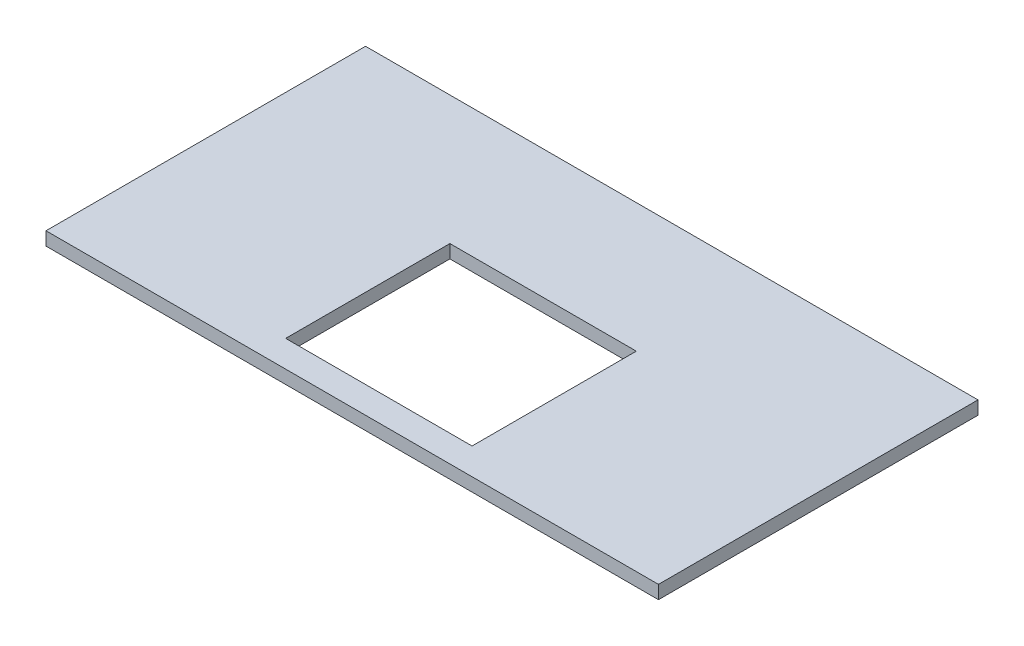
ISO-10303-21;
HEADER;
FILE_DESCRIPTION(('STEP AP214'),'2;1');
FILE_NAME('part.step','',(''),(''),'','','');
FILE_SCHEMA(('AUTOMOTIVE_DESIGN { 1 0 10303 214 1 1 1 1 }'));
ENDSEC;
DATA;
#1=APPLICATION_CONTEXT('core data for automotive mechanical design processes');
#2=APPLICATION_PROTOCOL_DEFINITION('international standard','automotive_design',2000,#1);
#3=PRODUCT_CONTEXT('',#1,'mechanical');
#4=PRODUCT('Part','Part','',(#3));
#5=PRODUCT_RELATED_PRODUCT_CATEGORY('part','',(#4));
#6=PRODUCT_DEFINITION_FORMATION('','',#4);
#7=PRODUCT_DEFINITION_CONTEXT('part definition',#1,'design');
#8=PRODUCT_DEFINITION('design','',#6,#7);
#9=PRODUCT_DEFINITION_SHAPE('','',#8);
#10=(LENGTH_UNIT() NAMED_UNIT(*) SI_UNIT(.MILLI.,.METRE.));
#11=(NAMED_UNIT(*) PLANE_ANGLE_UNIT() SI_UNIT($,.RADIAN.));
#12=(NAMED_UNIT(*) SI_UNIT($,.STERADIAN.) SOLID_ANGLE_UNIT());
#13=UNCERTAINTY_MEASURE_WITH_UNIT(LENGTH_MEASURE(1.E-05),#10,'distance_accuracy_value','');
#14=(GEOMETRIC_REPRESENTATION_CONTEXT(3) GLOBAL_UNCERTAINTY_ASSIGNED_CONTEXT((#13)) GLOBAL_UNIT_ASSIGNED_CONTEXT((#10,
#11,#12)) REPRESENTATION_CONTEXT('',''));
#15=CARTESIAN_POINT('',(0.,0.,0.));
#16=DIRECTION('',(0.,0.,1.));
#17=DIRECTION('',(1.,0.,0.));
#18=AXIS2_PLACEMENT_3D('',#15,#16,#17);
#19=CARTESIAN_POINT('',(0.,3.175,0.));
#20=DIRECTION('',(0.,-1.,0.));
#21=DIRECTION('',(0.,0.,-1.));
#22=AXIS2_PLACEMENT_3D('',#19,#20,#21);
#23=PLANE('',#22);
#24=DIRECTION('',(0.,0.,1.));
#25=VECTOR('',#24,1.);
#26=CARTESIAN_POINT('',(0.,3.175,0.));
#27=LINE('',#26,#25);
#28=CARTESIAN_POINT('',(0.,3.175,-76.2));
#29=VERTEX_POINT('',#28);
#30=CARTESIAN_POINT('',(0.,3.175,0.));
#31=VERTEX_POINT('',#30);
#32=EDGE_CURVE('E134',#29,#31,#27,.T.);
#33=ORIENTED_EDGE('',*,*,#32,.T.);
#34=DIRECTION('',(1.,0.,0.));
#35=VECTOR('',#34,1.);
#36=CARTESIAN_POINT('',(0.,3.175,0.));
#37=LINE('',#36,#35);
#38=CARTESIAN_POINT('',(146.05,3.175,0.));
#39=VERTEX_POINT('',#38);
#40=EDGE_CURVE('E137',#31,#39,#37,.T.);
#41=ORIENTED_EDGE('',*,*,#40,.T.);
#42=DIRECTION('',(0.,0.,-1.));
#43=VECTOR('',#42,1.);
#44=CARTESIAN_POINT('',(146.05,3.175,0.));
#45=LINE('',#44,#43);
#46=CARTESIAN_POINT('',(146.05,3.175,-76.2));
#47=VERTEX_POINT('',#46);
#48=EDGE_CURVE('E140',#39,#47,#45,.T.);
#49=ORIENTED_EDGE('',*,*,#48,.T.);
#50=DIRECTION('',(-1.,0.,0.));
#51=VECTOR('',#50,1.);
#52=CARTESIAN_POINT('',(0.,3.175,-76.2));
#53=LINE('',#52,#51);
#54=EDGE_CURVE('E142',#47,#29,#53,.T.);
#55=ORIENTED_EDGE('',*,*,#54,.T.);
#56=EDGE_LOOP('',(#33,#41,#49,#55));
#57=FACE_BOUND('',#56,.T.);
#58=DIRECTION('',(0.,0.,1.));
#59=VECTOR('',#58,1.);
#60=CARTESIAN_POINT('',(50.8,3.175,-6.35));
#61=LINE('',#60,#59);
#62=CARTESIAN_POINT('',(50.8,3.175,-45.5168));
#63=VERTEX_POINT('',#62);
#64=CARTESIAN_POINT('',(50.8,3.175,-6.35));
#65=VERTEX_POINT('',#64);
#66=EDGE_CURVE('E98',#63,#65,#61,.T.);
#67=ORIENTED_EDGE('',*,*,#66,.F.);
#68=DIRECTION('',(-1.,0.,0.));
#69=VECTOR('',#68,1.);
#70=CARTESIAN_POINT('',(50.8,3.175,-45.5168));
#71=LINE('',#70,#69);
#72=CARTESIAN_POINT('',(95.25,3.175,-45.5168));
#73=VERTEX_POINT('',#72);
#74=EDGE_CURVE('E120',#73,#63,#71,.T.);
#75=ORIENTED_EDGE('',*,*,#74,.F.);
#76=DIRECTION('',(0.,0.,-1.));
#77=VECTOR('',#76,1.);
#78=CARTESIAN_POINT('',(95.25,3.175,-6.35));
#79=LINE('',#78,#77);
#80=CARTESIAN_POINT('',(95.25,3.175,-6.35));
#81=VERTEX_POINT('',#80);
#82=EDGE_CURVE('E118',#81,#73,#79,.T.);
#83=ORIENTED_EDGE('',*,*,#82,.F.);
#84=DIRECTION('',(1.,0.,0.));
#85=VECTOR('',#84,1.);
#86=CARTESIAN_POINT('',(50.8,3.175,-6.35));
#87=LINE('',#86,#85);
#88=EDGE_CURVE('E106',#65,#81,#87,.T.);
#89=ORIENTED_EDGE('',*,*,#88,.F.);
#90=EDGE_LOOP('',(#67,#75,#83,#89));
#91=FACE_BOUND('',#90,.T.);
#92=ADVANCED_FACE('F33',(#57,#91),#23,.F.);
#93=CARTESIAN_POINT('',(0.,0.,0.));
#94=DIRECTION('',(0.,-1.,0.));
#95=DIRECTION('',(0.,0.,-1.));
#96=AXIS2_PLACEMENT_3D('',#93,#94,#95);
#97=PLANE('',#96);
#98=DIRECTION('',(0.,0.,1.));
#99=VECTOR('',#98,1.);
#100=CARTESIAN_POINT('',(0.,0.,0.));
#101=LINE('',#100,#99);
#102=CARTESIAN_POINT('',(0.,0.,-76.2));
#103=VERTEX_POINT('',#102);
#104=CARTESIAN_POINT('',(0.,0.,0.));
#105=VERTEX_POINT('',#104);
#106=EDGE_CURVE('E114',#103,#105,#101,.T.);
#107=ORIENTED_EDGE('',*,*,#106,.F.);
#108=DIRECTION('',(-1.,0.,0.));
#109=VECTOR('',#108,1.);
#110=CARTESIAN_POINT('',(0.,0.,-76.2));
#111=LINE('',#110,#109);
#112=CARTESIAN_POINT('',(146.05,0.,-76.2));
#113=VERTEX_POINT('',#112);
#114=EDGE_CURVE('E138',#113,#103,#111,.T.);
#115=ORIENTED_EDGE('',*,*,#114,.F.);
#116=DIRECTION('',(0.,0.,-1.));
#117=VECTOR('',#116,1.);
#118=CARTESIAN_POINT('',(146.05,0.,0.));
#119=LINE('',#118,#117);
#120=CARTESIAN_POINT('',(146.05,0.,0.));
#121=VERTEX_POINT('',#120);
#122=EDGE_CURVE('E149',#121,#113,#119,.T.);
#123=ORIENTED_EDGE('',*,*,#122,.F.);
#124=DIRECTION('',(1.,0.,0.));
#125=VECTOR('',#124,1.);
#126=CARTESIAN_POINT('',(0.,0.,0.));
#127=LINE('',#126,#125);
#128=EDGE_CURVE('E147',#105,#121,#127,.T.);
#129=ORIENTED_EDGE('',*,*,#128,.F.);
#130=EDGE_LOOP('',(#107,#115,#123,#129));
#131=FACE_BOUND('',#130,.T.);
#132=DIRECTION('',(-1.,0.,0.));
#133=VECTOR('',#132,1.);
#134=CARTESIAN_POINT('',(50.8,0.,-45.5168));
#135=LINE('',#134,#133);
#136=CARTESIAN_POINT('',(95.25,0.,-45.5168));
#137=VERTEX_POINT('',#136);
#138=CARTESIAN_POINT('',(50.8,0.,-45.5168));
#139=VERTEX_POINT('',#138);
#140=EDGE_CURVE('E107',#137,#139,#135,.T.);
#141=ORIENTED_EDGE('',*,*,#140,.T.);
#142=DIRECTION('',(0.,0.,1.));
#143=VECTOR('',#142,1.);
#144=CARTESIAN_POINT('',(50.8,0.,-6.35));
#145=LINE('',#144,#143);
#146=CARTESIAN_POINT('',(50.8,0.,-6.35));
#147=VERTEX_POINT('',#146);
#148=EDGE_CURVE('E56',#139,#147,#145,.T.);
#149=ORIENTED_EDGE('',*,*,#148,.T.);
#150=DIRECTION('',(1.,0.,0.));
#151=VECTOR('',#150,1.);
#152=CARTESIAN_POINT('',(50.8,0.,-6.35));
#153=LINE('',#152,#151);
#154=CARTESIAN_POINT('',(95.25,0.,-6.35));
#155=VERTEX_POINT('',#154);
#156=EDGE_CURVE('E113',#147,#155,#153,.T.);
#157=ORIENTED_EDGE('',*,*,#156,.T.);
#158=DIRECTION('',(0.,0.,-1.));
#159=VECTOR('',#158,1.);
#160=CARTESIAN_POINT('',(95.25,0.,-6.35));
#161=LINE('',#160,#159);
#162=EDGE_CURVE('E126',#155,#137,#161,.T.);
#163=ORIENTED_EDGE('',*,*,#162,.T.);
#164=EDGE_LOOP('',(#141,#149,#157,#163));
#165=FACE_BOUND('',#164,.T.);
#166=ADVANCED_FACE('F167',(#131,#165),#97,.T.);
#167=CARTESIAN_POINT('',(0.,3.175,0.));
#168=DIRECTION('',(1.,0.,0.));
#169=DIRECTION('',(0.,0.,-1.));
#170=AXIS2_PLACEMENT_3D('',#167,#168,#169);
#171=PLANE('',#170);
#172=ORIENTED_EDGE('',*,*,#106,.T.);
#173=DIRECTION('',(0.,-1.,0.));
#174=VECTOR('',#173,1.);
#175=CARTESIAN_POINT('',(0.,3.175,0.));
#176=LINE('',#175,#174);
#177=EDGE_CURVE('E11',#31,#105,#176,.T.);
#178=ORIENTED_EDGE('',*,*,#177,.F.);
#179=ORIENTED_EDGE('',*,*,#32,.F.);
#180=DIRECTION('',(0.,-1.,0.));
#181=VECTOR('',#180,1.);
#182=CARTESIAN_POINT('',(0.,3.175,-76.2));
#183=LINE('',#182,#181);
#184=EDGE_CURVE('E144',#29,#103,#183,.T.);
#185=ORIENTED_EDGE('',*,*,#184,.T.);
#186=EDGE_LOOP('',(#172,#178,#179,#185));
#187=FACE_BOUND('',#186,.T.);
#188=ADVANCED_FACE('F35',(#187),#171,.F.);
#189=CARTESIAN_POINT('',(0.,3.175,0.));
#190=DIRECTION('',(0.,0.,-1.));
#191=DIRECTION('',(-1.,0.,0.));
#192=AXIS2_PLACEMENT_3D('',#189,#190,#191);
#193=PLANE('',#192);
#194=ORIENTED_EDGE('',*,*,#128,.T.);
#195=DIRECTION('',(0.,-1.,0.));
#196=VECTOR('',#195,1.);
#197=CARTESIAN_POINT('',(146.05,3.175,0.));
#198=LINE('',#197,#196);
#199=EDGE_CURVE('E41',#39,#121,#198,.T.);
#200=ORIENTED_EDGE('',*,*,#199,.F.);
#201=ORIENTED_EDGE('',*,*,#40,.F.);
#202=ORIENTED_EDGE('',*,*,#177,.T.);
#203=EDGE_LOOP('',(#194,#200,#201,#202));
#204=FACE_BOUND('',#203,.T.);
#205=ADVANCED_FACE('F177',(#204),#193,.F.);
#206=CARTESIAN_POINT('',(146.05,3.175,0.));
#207=DIRECTION('',(-1.,0.,0.));
#208=DIRECTION('',(0.,0.,1.));
#209=AXIS2_PLACEMENT_3D('',#206,#207,#208);
#210=PLANE('',#209);
#211=ORIENTED_EDGE('',*,*,#122,.T.);
#212=DIRECTION('',(0.,-1.,0.));
#213=VECTOR('',#212,1.);
#214=CARTESIAN_POINT('',(146.05,3.175,-76.2));
#215=LINE('',#214,#213);
#216=EDGE_CURVE('E154',#47,#113,#215,.T.);
#217=ORIENTED_EDGE('',*,*,#216,.F.);
#218=ORIENTED_EDGE('',*,*,#48,.F.);
#219=ORIENTED_EDGE('',*,*,#199,.T.);
#220=EDGE_LOOP('',(#211,#217,#218,#219));
#221=FACE_BOUND('',#220,.T.);
#222=ADVANCED_FACE('F161',(#221),#210,.F.);
#223=CARTESIAN_POINT('',(0.,3.175,-76.2));
#224=DIRECTION('',(0.,0.,1.));
#225=DIRECTION('',(1.,0.,0.));
#226=AXIS2_PLACEMENT_3D('',#223,#224,#225);
#227=PLANE('',#226);
#228=ORIENTED_EDGE('',*,*,#114,.T.);
#229=ORIENTED_EDGE('',*,*,#184,.F.);
#230=ORIENTED_EDGE('',*,*,#54,.F.);
#231=ORIENTED_EDGE('',*,*,#216,.T.);
#232=EDGE_LOOP('',(#228,#229,#230,#231));
#233=FACE_BOUND('',#232,.T.);
#234=ADVANCED_FACE('F171',(#233),#227,.F.);
#235=CARTESIAN_POINT('',(50.8,3.175,-6.35));
#236=DIRECTION('',(1.,0.,0.));
#237=DIRECTION('',(0.,0.,-1.));
#238=AXIS2_PLACEMENT_3D('',#235,#236,#237);
#239=PLANE('',#238);
#240=ORIENTED_EDGE('',*,*,#148,.F.);
#241=DIRECTION('',(0.,-1.,0.));
#242=VECTOR('',#241,1.);
#243=CARTESIAN_POINT('',(50.8,3.175,-45.5168));
#244=LINE('',#243,#242);
#245=EDGE_CURVE('E102',#63,#139,#244,.T.);
#246=ORIENTED_EDGE('',*,*,#245,.F.);
#247=ORIENTED_EDGE('',*,*,#66,.T.);
#248=DIRECTION('',(0.,-1.,0.));
#249=VECTOR('',#248,1.);
#250=CARTESIAN_POINT('',(50.8,3.175,-6.35));
#251=LINE('',#250,#249);
#252=EDGE_CURVE('E101',#65,#147,#251,.T.);
#253=ORIENTED_EDGE('',*,*,#252,.T.);
#254=EDGE_LOOP('',(#240,#246,#247,#253));
#255=FACE_BOUND('',#254,.T.);
#256=ADVANCED_FACE('F100',(#255),#239,.T.);
#257=CARTESIAN_POINT('',(50.8,3.175,-6.35));
#258=DIRECTION('',(0.,0.,-1.));
#259=DIRECTION('',(-1.,0.,0.));
#260=AXIS2_PLACEMENT_3D('',#257,#258,#259);
#261=PLANE('',#260);
#262=ORIENTED_EDGE('',*,*,#156,.F.);
#263=ORIENTED_EDGE('',*,*,#252,.F.);
#264=ORIENTED_EDGE('',*,*,#88,.T.);
#265=DIRECTION('',(0.,-1.,0.));
#266=VECTOR('',#265,1.);
#267=CARTESIAN_POINT('',(95.25,3.175,-6.35));
#268=LINE('',#267,#266);
#269=EDGE_CURVE('E115',#81,#155,#268,.T.);
#270=ORIENTED_EDGE('',*,*,#269,.T.);
#271=EDGE_LOOP('',(#262,#263,#264,#270));
#272=FACE_BOUND('',#271,.T.);
#273=ADVANCED_FACE('F110',(#272),#261,.T.);
#274=CARTESIAN_POINT('',(95.25,3.175,-6.35));
#275=DIRECTION('',(-1.,0.,0.));
#276=DIRECTION('',(0.,0.,1.));
#277=AXIS2_PLACEMENT_3D('',#274,#275,#276);
#278=PLANE('',#277);
#279=ORIENTED_EDGE('',*,*,#162,.F.);
#280=ORIENTED_EDGE('',*,*,#269,.F.);
#281=ORIENTED_EDGE('',*,*,#82,.T.);
#282=DIRECTION('',(0.,-1.,0.));
#283=VECTOR('',#282,1.);
#284=CARTESIAN_POINT('',(95.25,3.175,-45.5168));
#285=LINE('',#284,#283);
#286=EDGE_CURVE('E48',#73,#137,#285,.T.);
#287=ORIENTED_EDGE('',*,*,#286,.T.);
#288=EDGE_LOOP('',(#279,#280,#281,#287));
#289=FACE_BOUND('',#288,.T.);
#290=ADVANCED_FACE('F200',(#289),#278,.T.);
#291=CARTESIAN_POINT('',(50.8,3.175,-45.5168));
#292=DIRECTION('',(0.,0.,1.));
#293=DIRECTION('',(1.,0.,0.));
#294=AXIS2_PLACEMENT_3D('',#291,#292,#293);
#295=PLANE('',#294);
#296=ORIENTED_EDGE('',*,*,#140,.F.);
#297=ORIENTED_EDGE('',*,*,#286,.F.);
#298=ORIENTED_EDGE('',*,*,#74,.T.);
#299=ORIENTED_EDGE('',*,*,#245,.T.);
#300=EDGE_LOOP('',(#296,#297,#298,#299));
#301=FACE_BOUND('',#300,.T.);
#302=ADVANCED_FACE('F204',(#301),#295,.T.);
#303=CLOSED_SHELL('',(#92,#166,#188,#205,#222,#234,#256,#273,#290,#302));
#304=MANIFOLD_SOLID_BREP('B2',#303);
#305=ADVANCED_BREP_SHAPE_REPRESENTATION('',(#18,#304),#14);
#306=SHAPE_DEFINITION_REPRESENTATION(#9,#305);
ENDSEC;
END-ISO-10303-21;
